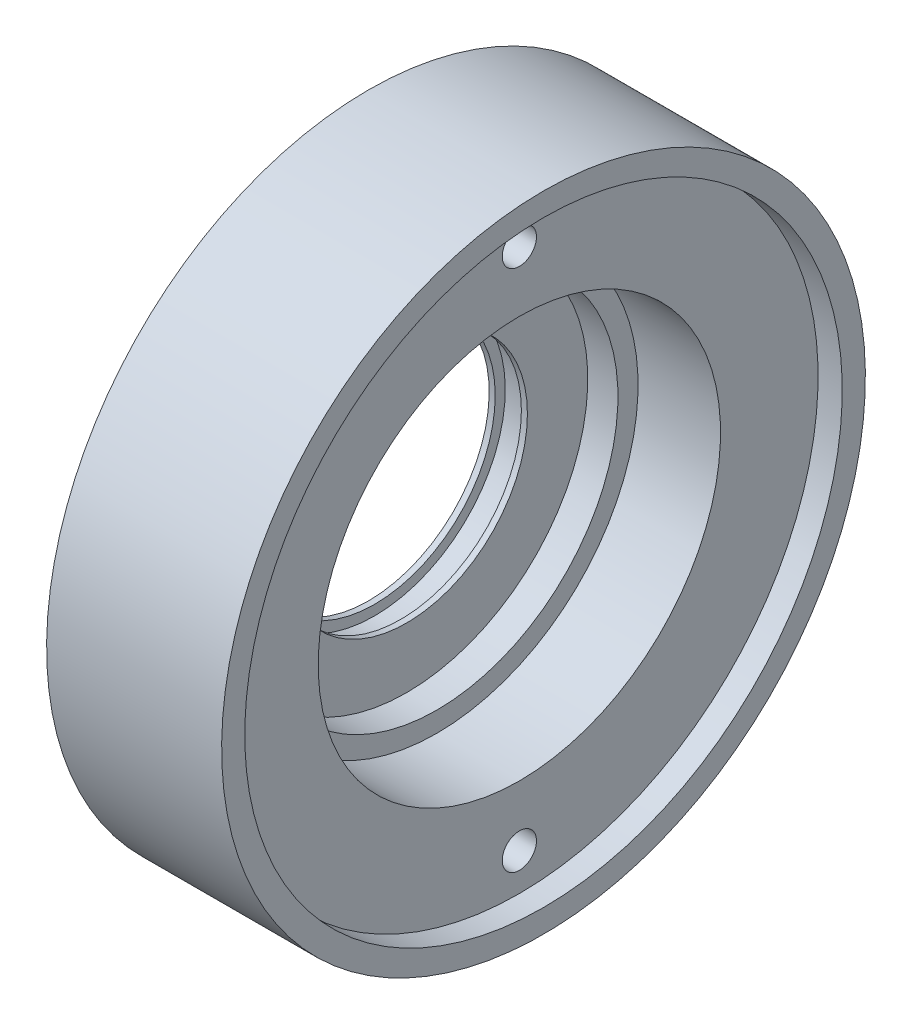
ISO-10303-21;
HEADER;
FILE_DESCRIPTION(('STEP AP214'),'2;1');
FILE_NAME('part.step','',(''),(''),'','','');
FILE_SCHEMA(('AUTOMOTIVE_DESIGN { 1 0 10303 214 1 1 1 1 }'));
ENDSEC;
DATA;
#1=APPLICATION_CONTEXT('core data for automotive mechanical design processes');
#2=APPLICATION_PROTOCOL_DEFINITION('international standard','automotive_design',2000,#1);
#3=PRODUCT_CONTEXT('',#1,'mechanical');
#4=PRODUCT('Part','Part','',(#3));
#5=PRODUCT_RELATED_PRODUCT_CATEGORY('part','',(#4));
#6=PRODUCT_DEFINITION_FORMATION('','',#4);
#7=PRODUCT_DEFINITION_CONTEXT('part definition',#1,'design');
#8=PRODUCT_DEFINITION('design','',#6,#7);
#9=PRODUCT_DEFINITION_SHAPE('','',#8);
#10=(LENGTH_UNIT() NAMED_UNIT(*) SI_UNIT(.MILLI.,.METRE.));
#11=(NAMED_UNIT(*) PLANE_ANGLE_UNIT() SI_UNIT($,.RADIAN.));
#12=(NAMED_UNIT(*) SI_UNIT($,.STERADIAN.) SOLID_ANGLE_UNIT());
#13=UNCERTAINTY_MEASURE_WITH_UNIT(LENGTH_MEASURE(1.E-05),#10,'distance_accuracy_value','');
#14=(GEOMETRIC_REPRESENTATION_CONTEXT(3) GLOBAL_UNCERTAINTY_ASSIGNED_CONTEXT((#13)) GLOBAL_UNIT_ASSIGNED_CONTEXT((#10,
#11,#12)) REPRESENTATION_CONTEXT('',''));
#15=CARTESIAN_POINT('',(0.,0.,0.));
#16=DIRECTION('',(0.,0.,1.));
#17=DIRECTION('',(1.,0.,0.));
#18=AXIS2_PLACEMENT_3D('',#15,#16,#17);
#19=CARTESIAN_POINT('',(56.,0.,0.));
#20=DIRECTION('',(-1.,0.,0.));
#21=DIRECTION('',(0.,-1.,0.));
#22=AXIS2_PLACEMENT_3D('',#19,#20,#21);
#23=CYLINDRICAL_SURFACE('',#22,60.);
#24=CARTESIAN_POINT('',(0.,0.,0.));
#25=DIRECTION('',(-1.,0.,0.));
#26=DIRECTION('',(0.,-1.,0.));
#27=AXIS2_PLACEMENT_3D('',#24,#25,#26);
#28=CIRCLE('',#27,60.);
#29=CARTESIAN_POINT('',(0.,-60.,0.));
#30=VERTEX_POINT('',#29);
#31=EDGE_CURVE('E79',#30,#30,#28,.T.);
#32=ORIENTED_EDGE('',*,*,#31,.T.);
#33=EDGE_LOOP('',(#32));
#34=FACE_BOUND('',#33,.T.);
#35=CARTESIAN_POINT('',(3.,0.,0.));
#36=DIRECTION('',(1.,0.,0.));
#37=DIRECTION('',(0.,0.,-1.));
#38=AXIS2_PLACEMENT_3D('',#35,#36,#37);
#39=CIRCLE('',#38,60.);
#40=CARTESIAN_POINT('',(3.,0.,-60.));
#41=VERTEX_POINT('',#40);
#42=EDGE_CURVE('E80',#41,#41,#39,.F.);
#43=ORIENTED_EDGE('',*,*,#42,.F.);
#44=EDGE_LOOP('',(#43));
#45=FACE_BOUND('',#44,.T.);
#46=ADVANCED_FACE('F47',(#34,#45),#23,.F.);
#47=CARTESIAN_POINT('',(0.,0.,0.));
#48=DIRECTION('',(-1.,0.,0.));
#49=DIRECTION('',(0.,-1.,0.));
#50=AXIS2_PLACEMENT_3D('',#47,#48,#49);
#51=PLANE('',#50);
#52=CARTESIAN_POINT('',(0.,130.,0.));
#53=DIRECTION('',(-1.,0.,0.));
#54=DIRECTION('',(0.,0.,1.));
#55=AXIS2_PLACEMENT_3D('',#52,#53,#54);
#56=CIRCLE('',#55,12.5);
#57=CARTESIAN_POINT('',(0.,130.,12.5));
#58=VERTEX_POINT('',#57);
#59=EDGE_CURVE('E389',#58,#58,#56,.T.);
#60=ORIENTED_EDGE('',*,*,#59,.F.);
#61=EDGE_LOOP('',(#60));
#62=FACE_BOUND('',#61,.T.);
#63=CARTESIAN_POINT('',(0.,-130.,0.));
#64=DIRECTION('',(-1.,0.,0.));
#65=DIRECTION('',(0.,0.,1.));
#66=AXIS2_PLACEMENT_3D('',#63,#64,#65);
#67=CIRCLE('',#66,12.5);
#68=CARTESIAN_POINT('',(0.,-130.,12.5));
#69=VERTEX_POINT('',#68);
#70=EDGE_CURVE('E110',#69,#69,#67,.T.);
#71=ORIENTED_EDGE('',*,*,#70,.F.);
#72=EDGE_LOOP('',(#71));
#73=FACE_BOUND('',#72,.T.);
#74=ORIENTED_EDGE('',*,*,#31,.F.);
#75=EDGE_LOOP('',(#74));
#76=FACE_BOUND('',#75,.T.);
#77=CARTESIAN_POINT('',(0.,0.,0.));
#78=DIRECTION('',(1.,0.,0.));
#79=DIRECTION('',(0.,1.,0.));
#80=AXIS2_PLACEMENT_3D('',#77,#78,#79);
#81=CIRCLE('',#80,160.);
#82=CARTESIAN_POINT('',(0.,160.,0.));
#83=VERTEX_POINT('',#82);
#84=EDGE_CURVE('E11',#83,#83,#81,.T.);
#85=ORIENTED_EDGE('',*,*,#84,.F.);
#86=EDGE_LOOP('',(#85));
#87=FACE_BOUND('',#86,.T.);
#88=ADVANCED_FACE('F49',(#62,#73,#76,#87),#51,.T.);
#89=CARTESIAN_POINT('',(87.,0.,0.));
#90=DIRECTION('',(1.,0.,0.));
#91=DIRECTION('',(0.,1.,0.));
#92=AXIS2_PLACEMENT_3D('',#89,#90,#91);
#93=CYLINDRICAL_SURFACE('',#92,160.);
#94=ORIENTED_EDGE('',*,*,#84,.T.);
#95=EDGE_LOOP('',(#94));
#96=FACE_BOUND('',#95,.T.);
#97=CARTESIAN_POINT('',(87.,0.,0.));
#98=DIRECTION('',(1.,0.,0.));
#99=DIRECTION('',(0.,1.,0.));
#100=AXIS2_PLACEMENT_3D('',#97,#98,#99);
#101=CIRCLE('',#100,160.);
#102=CARTESIAN_POINT('',(87.,160.,0.));
#103=VERTEX_POINT('',#102);
#104=EDGE_CURVE('E56',#103,#103,#101,.T.);
#105=ORIENTED_EDGE('',*,*,#104,.F.);
#106=EDGE_LOOP('',(#105));
#107=FACE_BOUND('',#106,.T.);
#108=ADVANCED_FACE('F143',(#96,#107),#93,.T.);
#109=CARTESIAN_POINT('',(87.,160.,0.));
#110=DIRECTION('',(1.,0.,0.));
#111=DIRECTION('',(0.,1.,0.));
#112=AXIS2_PLACEMENT_3D('',#109,#110,#111);
#113=PLANE('',#112);
#114=CARTESIAN_POINT('',(87.,0.,0.));
#115=DIRECTION('',(1.,0.,0.));
#116=DIRECTION('',(0.,1.,0.));
#117=AXIS2_PLACEMENT_3D('',#114,#115,#116);
#118=CIRCLE('',#117,148.5);
#119=CARTESIAN_POINT('',(87.,148.5,0.));
#120=VERTEX_POINT('',#119);
#121=EDGE_CURVE('E72',#120,#120,#118,.T.);
#122=ORIENTED_EDGE('',*,*,#121,.F.);
#123=EDGE_LOOP('',(#122));
#124=FACE_BOUND('',#123,.T.);
#125=ORIENTED_EDGE('',*,*,#104,.T.);
#126=EDGE_LOOP('',(#125));
#127=FACE_BOUND('',#126,.T.);
#128=ADVANCED_FACE('F140',(#124,#127),#113,.T.);
#129=CARTESIAN_POINT('',(75.,0.,0.));
#130=DIRECTION('',(1.,0.,0.));
#131=DIRECTION('',(0.,1.,0.));
#132=AXIS2_PLACEMENT_3D('',#129,#130,#131);
#133=CYLINDRICAL_SURFACE('',#132,148.5);
#134=CARTESIAN_POINT('',(75.,0.,0.));
#135=DIRECTION('',(1.,0.,0.));
#136=DIRECTION('',(0.,1.,0.));
#137=AXIS2_PLACEMENT_3D('',#134,#135,#136);
#138=CIRCLE('',#137,148.5);
#139=CARTESIAN_POINT('',(75.,148.5,0.));
#140=VERTEX_POINT('',#139);
#141=EDGE_CURVE('E64',#140,#140,#138,.T.);
#142=ORIENTED_EDGE('',*,*,#141,.F.);
#143=EDGE_LOOP('',(#142));
#144=FACE_BOUND('',#143,.T.);
#145=ORIENTED_EDGE('',*,*,#121,.T.);
#146=EDGE_LOOP('',(#145));
#147=FACE_BOUND('',#146,.T.);
#148=ADVANCED_FACE('F138',(#144,#147),#133,.F.);
#149=CARTESIAN_POINT('',(75.,0.,0.));
#150=DIRECTION('',(1.,0.,0.));
#151=DIRECTION('',(0.,1.,0.));
#152=AXIS2_PLACEMENT_3D('',#149,#150,#151);
#153=PLANE('',#152);
#154=CARTESIAN_POINT('',(75.,130.,0.));
#155=DIRECTION('',(1.,0.,0.));
#156=DIRECTION('',(0.,1.,0.));
#157=AXIS2_PLACEMENT_3D('',#154,#155,#156);
#158=CIRCLE('',#157,8.50000000000001);
#159=CARTESIAN_POINT('',(75.,138.5,0.));
#160=VERTEX_POINT('',#159);
#161=EDGE_CURVE('E51',#160,#160,#158,.T.);
#162=ORIENTED_EDGE('',*,*,#161,.F.);
#163=EDGE_LOOP('',(#162));
#164=FACE_BOUND('',#163,.T.);
#165=CARTESIAN_POINT('',(75.,-130.,0.));
#166=DIRECTION('',(1.,0.,0.));
#167=DIRECTION('',(0.,1.,0.));
#168=AXIS2_PLACEMENT_3D('',#165,#166,#167);
#169=CIRCLE('',#168,8.50000000000001);
#170=CARTESIAN_POINT('',(75.,-121.5,0.));
#171=VERTEX_POINT('',#170);
#172=EDGE_CURVE('E88',#171,#171,#169,.T.);
#173=ORIENTED_EDGE('',*,*,#172,.F.);
#174=EDGE_LOOP('',(#173));
#175=FACE_BOUND('',#174,.T.);
#176=CARTESIAN_POINT('',(75.,0.,0.));
#177=DIRECTION('',(1.,0.,0.));
#178=DIRECTION('',(0.,1.,0.));
#179=AXIS2_PLACEMENT_3D('',#176,#177,#178);
#180=CIRCLE('',#179,100.);
#181=CARTESIAN_POINT('',(75.,100.,0.));
#182=VERTEX_POINT('',#181);
#183=EDGE_CURVE('E68',#182,#182,#180,.T.);
#184=ORIENTED_EDGE('',*,*,#183,.F.);
#185=EDGE_LOOP('',(#184));
#186=FACE_BOUND('',#185,.T.);
#187=ORIENTED_EDGE('',*,*,#141,.T.);
#188=EDGE_LOOP('',(#187));
#189=FACE_BOUND('',#188,.T.);
#190=ADVANCED_FACE('F193',(#164,#175,#186,#189),#153,.T.);
#191=CARTESIAN_POINT('',(34.,0.,0.));
#192=DIRECTION('',(1.,0.,0.));
#193=DIRECTION('',(0.,1.,0.));
#194=AXIS2_PLACEMENT_3D('',#191,#192,#193);
#195=CYLINDRICAL_SURFACE('',#194,100.);
#196=ORIENTED_EDGE('',*,*,#183,.T.);
#197=EDGE_LOOP('',(#196));
#198=FACE_BOUND('',#197,.T.);
#199=CARTESIAN_POINT('',(34.,0.,0.));
#200=DIRECTION('',(1.,0.,0.));
#201=DIRECTION('',(0.,1.,0.));
#202=AXIS2_PLACEMENT_3D('',#199,#200,#201);
#203=CIRCLE('',#202,100.);
#204=CARTESIAN_POINT('',(34.,100.,0.));
#205=VERTEX_POINT('',#204);
#206=EDGE_CURVE('E73',#205,#205,#203,.T.);
#207=ORIENTED_EDGE('',*,*,#206,.F.);
#208=EDGE_LOOP('',(#207));
#209=FACE_BOUND('',#208,.T.);
#210=ADVANCED_FACE('F187',(#198,#209),#195,.F.);
#211=CARTESIAN_POINT('',(34.,0.,0.));
#212=DIRECTION('',(1.,0.,0.));
#213=DIRECTION('',(0.,1.,0.));
#214=AXIS2_PLACEMENT_3D('',#211,#212,#213);
#215=PLANE('',#214);
#216=CARTESIAN_POINT('',(34.,0.,0.));
#217=DIRECTION('',(1.,0.,0.));
#218=DIRECTION('',(0.,1.,0.));
#219=AXIS2_PLACEMENT_3D('',#216,#217,#218);
#220=CIRCLE('',#219,90.);
#221=CARTESIAN_POINT('',(34.,90.,0.));
#222=VERTEX_POINT('',#221);
#223=EDGE_CURVE('E123',#222,#222,#220,.T.);
#224=ORIENTED_EDGE('',*,*,#223,.F.);
#225=EDGE_LOOP('',(#224));
#226=FACE_BOUND('',#225,.T.);
#227=ORIENTED_EDGE('',*,*,#206,.T.);
#228=EDGE_LOOP('',(#227));
#229=FACE_BOUND('',#228,.T.);
#230=ADVANCED_FACE('F181',(#226,#229),#215,.T.);
#231=CARTESIAN_POINT('',(19.,0.,0.));
#232=DIRECTION('',(1.,0.,0.));
#233=DIRECTION('',(0.,1.,0.));
#234=AXIS2_PLACEMENT_3D('',#231,#232,#233);
#235=CYLINDRICAL_SURFACE('',#234,90.);
#236=ORIENTED_EDGE('',*,*,#223,.T.);
#237=EDGE_LOOP('',(#236));
#238=FACE_BOUND('',#237,.T.);
#239=CARTESIAN_POINT('',(19.,0.,0.));
#240=DIRECTION('',(1.,0.,0.));
#241=DIRECTION('',(0.,1.,0.));
#242=AXIS2_PLACEMENT_3D('',#239,#240,#241);
#243=CIRCLE('',#242,90.);
#244=CARTESIAN_POINT('',(19.,90.,0.));
#245=VERTEX_POINT('',#244);
#246=EDGE_CURVE('E78',#245,#245,#243,.T.);
#247=ORIENTED_EDGE('',*,*,#246,.F.);
#248=EDGE_LOOP('',(#247));
#249=FACE_BOUND('',#248,.T.);
#250=ADVANCED_FACE('F172',(#238,#249),#235,.F.);
#251=CARTESIAN_POINT('',(19.,0.,0.));
#252=DIRECTION('',(1.,0.,0.));
#253=DIRECTION('',(0.,1.,0.));
#254=AXIS2_PLACEMENT_3D('',#251,#252,#253);
#255=PLANE('',#254);
#256=CARTESIAN_POINT('',(19.,0.,0.));
#257=DIRECTION('',(1.,0.,0.));
#258=DIRECTION('',(0.,1.,0.));
#259=AXIS2_PLACEMENT_3D('',#256,#257,#258);
#260=CIRCLE('',#259,60.);
#261=CARTESIAN_POINT('',(19.,60.,0.));
#262=VERTEX_POINT('',#261);
#263=EDGE_CURVE('E74',#262,#262,#260,.T.);
#264=ORIENTED_EDGE('',*,*,#263,.F.);
#265=EDGE_LOOP('',(#264));
#266=FACE_BOUND('',#265,.T.);
#267=ORIENTED_EDGE('',*,*,#246,.T.);
#268=EDGE_LOOP('',(#267));
#269=FACE_BOUND('',#268,.T.);
#270=ADVANCED_FACE('F163',(#266,#269),#255,.T.);
#271=CARTESIAN_POINT('',(16.,0.,0.));
#272=DIRECTION('',(1.,0.,0.));
#273=DIRECTION('',(0.,0.,-1.));
#274=AXIS2_PLACEMENT_3D('',#271,#272,#273);
#275=CIRCLE('',#274,60.);
#276=CARTESIAN_POINT('',(16.,0.,-60.));
#277=VERTEX_POINT('',#276);
#278=EDGE_CURVE('E84',#277,#277,#275,.F.);
#279=ORIENTED_EDGE('',*,*,#278,.T.);
#280=EDGE_LOOP('',(#279));
#281=FACE_BOUND('',#280,.T.);
#282=ORIENTED_EDGE('',*,*,#263,.T.);
#283=EDGE_LOOP('',(#282));
#284=FACE_BOUND('',#283,.T.);
#285=ADVANCED_FACE('F155',(#281,#284),#23,.F.);
#286=CARTESIAN_POINT('',(16.,0.,0.));
#287=DIRECTION('',(1.,0.,0.));
#288=DIRECTION('',(0.,0.,-1.));
#289=AXIS2_PLACEMENT_3D('',#286,#287,#288);
#290=PLANE('',#289);
#291=CARTESIAN_POINT('',(16.,0.,0.));
#292=DIRECTION('',(1.,0.,0.));
#293=DIRECTION('',(0.,0.,-1.));
#294=AXIS2_PLACEMENT_3D('',#291,#292,#293);
#295=CIRCLE('',#294,65.);
#296=CARTESIAN_POINT('',(16.,-65.,0.));
#297=VERTEX_POINT('',#296);
#298=EDGE_CURVE('E85',#297,#297,#295,.T.);
#299=ORIENTED_EDGE('',*,*,#298,.F.);
#300=EDGE_LOOP('',(#299));
#301=FACE_BOUND('',#300,.T.);
#302=ORIENTED_EDGE('',*,*,#278,.F.);
#303=EDGE_LOOP('',(#302));
#304=FACE_BOUND('',#303,.T.);
#305=ADVANCED_FACE('F162',(#301,#304),#290,.F.);
#306=CARTESIAN_POINT('',(3.,0.,0.));
#307=DIRECTION('',(1.,0.,0.));
#308=DIRECTION('',(0.,0.,-1.));
#309=AXIS2_PLACEMENT_3D('',#306,#307,#308);
#310=PLANE('',#309);
#311=CARTESIAN_POINT('',(3.,0.,0.));
#312=DIRECTION('',(1.,0.,0.));
#313=DIRECTION('',(0.,0.,-1.));
#314=AXIS2_PLACEMENT_3D('',#311,#312,#313);
#315=CIRCLE('',#314,65.);
#316=CARTESIAN_POINT('',(3.,-65.,0.));
#317=VERTEX_POINT('',#316);
#318=EDGE_CURVE('E91',#317,#317,#315,.T.);
#319=ORIENTED_EDGE('',*,*,#318,.T.);
#320=EDGE_LOOP('',(#319));
#321=FACE_BOUND('',#320,.T.);
#322=ORIENTED_EDGE('',*,*,#42,.T.);
#323=EDGE_LOOP('',(#322));
#324=FACE_BOUND('',#323,.T.);
#325=ADVANCED_FACE('F169',(#321,#324),#310,.T.);
#326=CARTESIAN_POINT('',(16.,0.,0.));
#327=DIRECTION('',(-1.,0.,0.));
#328=DIRECTION('',(0.,-1.,0.));
#329=AXIS2_PLACEMENT_3D('',#326,#327,#328);
#330=CYLINDRICAL_SURFACE('',#329,65.);
#331=CARTESIAN_POINT('',(16.,-65.,0.));
#332=CARTESIAN_POINT('',(15.8645833333333,-65.,0.));
#333=CARTESIAN_POINT('',(15.7291666666667,-65.,0.));
#334=CARTESIAN_POINT('',(15.4583333333333,-65.,0.));
#335=CARTESIAN_POINT('',(15.3229166666667,-65.,0.));
#336=CARTESIAN_POINT('',(15.0520833333333,-65.,0.));
#337=CARTESIAN_POINT('',(14.9166666666667,-65.,0.));
#338=CARTESIAN_POINT('',(14.6458333333333,-65.,0.));
#339=CARTESIAN_POINT('',(14.5104166666667,-65.,0.));
#340=CARTESIAN_POINT('',(14.2395833333333,-65.,0.));
#341=CARTESIAN_POINT('',(14.1041666666667,-65.,0.));
#342=CARTESIAN_POINT('',(13.8333333333333,-65.,0.));
#343=CARTESIAN_POINT('',(13.6979166666667,-65.,0.));
#344=CARTESIAN_POINT('',(13.4270833333333,-65.,0.));
#345=CARTESIAN_POINT('',(13.2916666666667,-65.,0.));
#346=CARTESIAN_POINT('',(13.0208333333333,-65.,0.));
#347=CARTESIAN_POINT('',(12.8854166666667,-65.,0.));
#348=CARTESIAN_POINT('',(12.6145833333333,-65.,0.));
#349=CARTESIAN_POINT('',(12.4791666666667,-65.,0.));
#350=CARTESIAN_POINT('',(12.2083333333333,-65.,0.));
#351=CARTESIAN_POINT('',(12.0729166666667,-65.,0.));
#352=CARTESIAN_POINT('',(11.8020833333333,-65.,0.));
#353=CARTESIAN_POINT('',(11.6666666666667,-65.,0.));
#354=CARTESIAN_POINT('',(11.3958333333333,-65.,0.));
#355=CARTESIAN_POINT('',(11.2604166666667,-65.,0.));
#356=CARTESIAN_POINT('',(10.9895833333333,-65.,0.));
#357=CARTESIAN_POINT('',(10.8541666666667,-65.,0.));
#358=CARTESIAN_POINT('',(10.5833333333333,-65.,0.));
#359=CARTESIAN_POINT('',(10.4479166666667,-65.,0.));
#360=CARTESIAN_POINT('',(10.1770833333333,-65.,0.));
#361=CARTESIAN_POINT('',(10.0416666666667,-65.,0.));
#362=CARTESIAN_POINT('',(9.77083333333333,-65.,0.));
#363=CARTESIAN_POINT('',(9.63541666666667,-65.,0.));
#364=CARTESIAN_POINT('',(9.36458333333333,-65.,0.));
#365=CARTESIAN_POINT('',(9.22916666666667,-65.,0.));
#366=CARTESIAN_POINT('',(8.95833333333333,-65.,0.));
#367=CARTESIAN_POINT('',(8.82291666666667,-65.,0.));
#368=CARTESIAN_POINT('',(8.55208333333333,-65.,0.));
#369=CARTESIAN_POINT('',(8.41666666666667,-65.,0.));
#370=CARTESIAN_POINT('',(8.14583333333333,-65.,0.));
#371=CARTESIAN_POINT('',(8.01041666666667,-65.,0.));
#372=CARTESIAN_POINT('',(7.73958333333333,-65.,0.));
#373=CARTESIAN_POINT('',(7.60416666666667,-65.,0.));
#374=CARTESIAN_POINT('',(7.33333333333333,-65.,0.));
#375=CARTESIAN_POINT('',(7.19791666666667,-65.,0.));
#376=CARTESIAN_POINT('',(6.92708333333333,-65.,0.));
#377=CARTESIAN_POINT('',(6.79166666666667,-65.,0.));
#378=CARTESIAN_POINT('',(6.52083333333333,-65.,0.));
#379=CARTESIAN_POINT('',(6.38541666666667,-65.,0.));
#380=CARTESIAN_POINT('',(6.11458333333333,-65.,0.));
#381=CARTESIAN_POINT('',(5.97916666666667,-65.,0.));
#382=CARTESIAN_POINT('',(5.70833333333333,-65.,0.));
#383=CARTESIAN_POINT('',(5.57291666666667,-65.,0.));
#384=CARTESIAN_POINT('',(5.30208333333333,-65.,0.));
#385=CARTESIAN_POINT('',(5.16666666666667,-65.,0.));
#386=CARTESIAN_POINT('',(4.89583333333333,-65.,0.));
#387=CARTESIAN_POINT('',(4.76041666666667,-65.,0.));
#388=CARTESIAN_POINT('',(4.48958333333333,-65.,0.));
#389=CARTESIAN_POINT('',(4.35416666666667,-65.,0.));
#390=CARTESIAN_POINT('',(4.08333333333333,-65.,0.));
#391=CARTESIAN_POINT('',(3.94791666666667,-65.,0.));
#392=CARTESIAN_POINT('',(3.67708333333333,-65.,0.));
#393=CARTESIAN_POINT('',(3.54166666666667,-65.,0.));
#394=CARTESIAN_POINT('',(3.27083333333333,-65.,0.));
#395=CARTESIAN_POINT('',(3.13541666666667,-65.,0.));
#396=CARTESIAN_POINT('',(3.,-65.,0.));
#397=B_SPLINE_CURVE_WITH_KNOTS('',3,(#331,#332,#333,#334,#335,#336,#337,#338,#339,#340,#341,
#342,#343,#344,#345,#346,#347,#348,#349,#350,#351,#352,#353,#354,#355,#356,#357,#358,#359,#360,
#361,#362,#363,#364,#365,#366,#367,#368,#369,#370,#371,#372,#373,#374,#375,#376,#377,#378,#379,
#380,#381,#382,#383,#384,#385,#386,#387,#388,#389,#390,#391,#392,#393,#394,#395,#396),
.UNSPECIFIED.,.F.,.F.,(4,2,2,2,2,2,2,2,2,2,2,2,2,2,2,2,2,2,2,2,2,2,2,2,2,2,2,2,2,2,2,2,4),(0.,
0.406250000000002,0.812500000000001,1.21875,1.625,2.03125,2.4375,2.84375,3.25,3.65625,4.0625,
4.46875,4.875,5.28125,5.6875,6.09375,6.5,6.90625,7.3125,7.71875,8.125,8.53125,8.9375,9.34375,
9.75,10.15625,10.5625,10.96875,11.375,11.78125,12.1875,12.59375,13.),.UNSPECIFIED.);
#398=EDGE_CURVE('BSEAM245',#297,#317,#397,.T.);
#399=ORIENTED_EDGE('',*,*,#298,.T.);
#400=ORIENTED_EDGE('',*,*,#318,.F.);
#401=ORIENTED_EDGE('',*,*,#398,.T.);
#402=ORIENTED_EDGE('',*,*,#398,.F.);
#403=EDGE_LOOP('',(#399,#401,#400,#402));
#404=FACE_BOUND('',#403,.T.);
#405=ADVANCED_FACE('F245',(#404),#330,.F.);
#406=CARTESIAN_POINT('',(0.,-130.,0.));
#407=DIRECTION('',(-1.,0.,0.));
#408=DIRECTION('',(0.,0.,1.));
#409=AXIS2_PLACEMENT_3D('',#406,#407,#408);
#410=CYLINDRICAL_SURFACE('',#409,8.50000000000001);
#411=ORIENTED_EDGE('',*,*,#172,.T.);
#412=EDGE_LOOP('',(#411));
#413=FACE_BOUND('',#412,.T.);
#414=CARTESIAN_POINT('',(16.,-130.,0.));
#415=DIRECTION('',(-1.,0.,0.));
#416=DIRECTION('',(0.,0.,1.));
#417=AXIS2_PLACEMENT_3D('',#414,#415,#416);
#418=CIRCLE('',#417,8.50000000000001);
#419=CARTESIAN_POINT('',(16.,-130.,8.50000000000001));
#420=VERTEX_POINT('',#419);
#421=EDGE_CURVE('E92',#420,#420,#418,.T.);
#422=ORIENTED_EDGE('',*,*,#421,.T.);
#423=EDGE_LOOP('',(#422));
#424=FACE_BOUND('',#423,.T.);
#425=ADVANCED_FACE('F255',(#413,#424),#410,.F.);
#426=CARTESIAN_POINT('',(16.,-121.5,0.));
#427=DIRECTION('',(1.,0.,0.));
#428=DIRECTION('',(0.,0.,-1.));
#429=AXIS2_PLACEMENT_3D('',#426,#427,#428);
#430=PLANE('',#429);
#431=ORIENTED_EDGE('',*,*,#421,.F.);
#432=EDGE_LOOP('',(#431));
#433=FACE_BOUND('',#432,.T.);
#434=CARTESIAN_POINT('',(16.,-130.,0.));
#435=DIRECTION('',(-1.,0.,0.));
#436=DIRECTION('',(0.,0.,1.));
#437=AXIS2_PLACEMENT_3D('',#434,#435,#436);
#438=CIRCLE('',#437,12.5);
#439=CARTESIAN_POINT('',(16.,-130.,12.5));
#440=VERTEX_POINT('',#439);
#441=EDGE_CURVE('E102',#440,#440,#438,.T.);
#442=ORIENTED_EDGE('',*,*,#441,.T.);
#443=EDGE_LOOP('',(#442));
#444=FACE_BOUND('',#443,.T.);
#445=ADVANCED_FACE('F265',(#433,#444),#430,.F.);
#446=CARTESIAN_POINT('',(0.,-130.,0.));
#447=DIRECTION('',(-1.,0.,0.));
#448=DIRECTION('',(0.,0.,1.));
#449=AXIS2_PLACEMENT_3D('',#446,#447,#448);
#450=CYLINDRICAL_SURFACE('',#449,12.5);
#451=ORIENTED_EDGE('',*,*,#441,.F.);
#452=EDGE_LOOP('',(#451));
#453=FACE_BOUND('',#452,.T.);
#454=ORIENTED_EDGE('',*,*,#70,.T.);
#455=EDGE_LOOP('',(#454));
#456=FACE_BOUND('',#455,.T.);
#457=ADVANCED_FACE('F274',(#453,#456),#450,.F.);
#458=CARTESIAN_POINT('',(0.,130.,0.));
#459=DIRECTION('',(-1.,0.,0.));
#460=DIRECTION('',(0.,0.,1.));
#461=AXIS2_PLACEMENT_3D('',#458,#459,#460);
#462=CYLINDRICAL_SURFACE('',#461,8.50000000000001);
#463=ORIENTED_EDGE('',*,*,#161,.T.);
#464=EDGE_LOOP('',(#463));
#465=FACE_BOUND('',#464,.T.);
#466=CARTESIAN_POINT('',(16.,130.,0.));
#467=DIRECTION('',(-1.,0.,0.));
#468=DIRECTION('',(0.,0.,1.));
#469=AXIS2_PLACEMENT_3D('',#466,#467,#468);
#470=CIRCLE('',#469,8.50000000000001);
#471=CARTESIAN_POINT('',(16.,130.,8.50000000000001));
#472=VERTEX_POINT('',#471);
#473=EDGE_CURVE('E395',#472,#472,#470,.T.);
#474=ORIENTED_EDGE('',*,*,#473,.T.);
#475=EDGE_LOOP('',(#474));
#476=FACE_BOUND('',#475,.T.);
#477=ADVANCED_FACE('F284',(#465,#476),#462,.F.);
#478=CARTESIAN_POINT('',(16.,138.5,0.));
#479=DIRECTION('',(1.,0.,0.));
#480=DIRECTION('',(0.,0.,-1.));
#481=AXIS2_PLACEMENT_3D('',#478,#479,#480);
#482=PLANE('',#481);
#483=ORIENTED_EDGE('',*,*,#473,.F.);
#484=EDGE_LOOP('',(#483));
#485=FACE_BOUND('',#484,.T.);
#486=CARTESIAN_POINT('',(16.,130.,0.));
#487=DIRECTION('',(-1.,0.,0.));
#488=DIRECTION('',(0.,0.,1.));
#489=AXIS2_PLACEMENT_3D('',#486,#487,#488);
#490=CIRCLE('',#489,12.5);
#491=CARTESIAN_POINT('',(16.,130.,12.5));
#492=VERTEX_POINT('',#491);
#493=EDGE_CURVE('E386',#492,#492,#490,.T.);
#494=ORIENTED_EDGE('',*,*,#493,.T.);
#495=EDGE_LOOP('',(#494));
#496=FACE_BOUND('',#495,.T.);
#497=ADVANCED_FACE('F294',(#485,#496),#482,.F.);
#498=CARTESIAN_POINT('',(0.,130.,0.));
#499=DIRECTION('',(-1.,0.,0.));
#500=DIRECTION('',(0.,0.,1.));
#501=AXIS2_PLACEMENT_3D('',#498,#499,#500);
#502=CYLINDRICAL_SURFACE('',#501,12.5);
#503=ORIENTED_EDGE('',*,*,#493,.F.);
#504=EDGE_LOOP('',(#503));
#505=FACE_BOUND('',#504,.T.);
#506=ORIENTED_EDGE('',*,*,#59,.T.);
#507=EDGE_LOOP('',(#506));
#508=FACE_BOUND('',#507,.T.);
#509=ADVANCED_FACE('F304',(#505,#508),#502,.F.);
#510=CLOSED_SHELL('',(#46,#88,#108,#128,#148,#190,#210,#230,#250,#270,#285,#305,#325,#405,#425,
#445,#457,#477,#497,#509));
#511=MANIFOLD_SOLID_BREP('B2',#510);
#512=ADVANCED_BREP_SHAPE_REPRESENTATION('',(#18,#511),#14);
#513=SHAPE_DEFINITION_REPRESENTATION(#9,#512);
ENDSEC;
END-ISO-10303-21;
